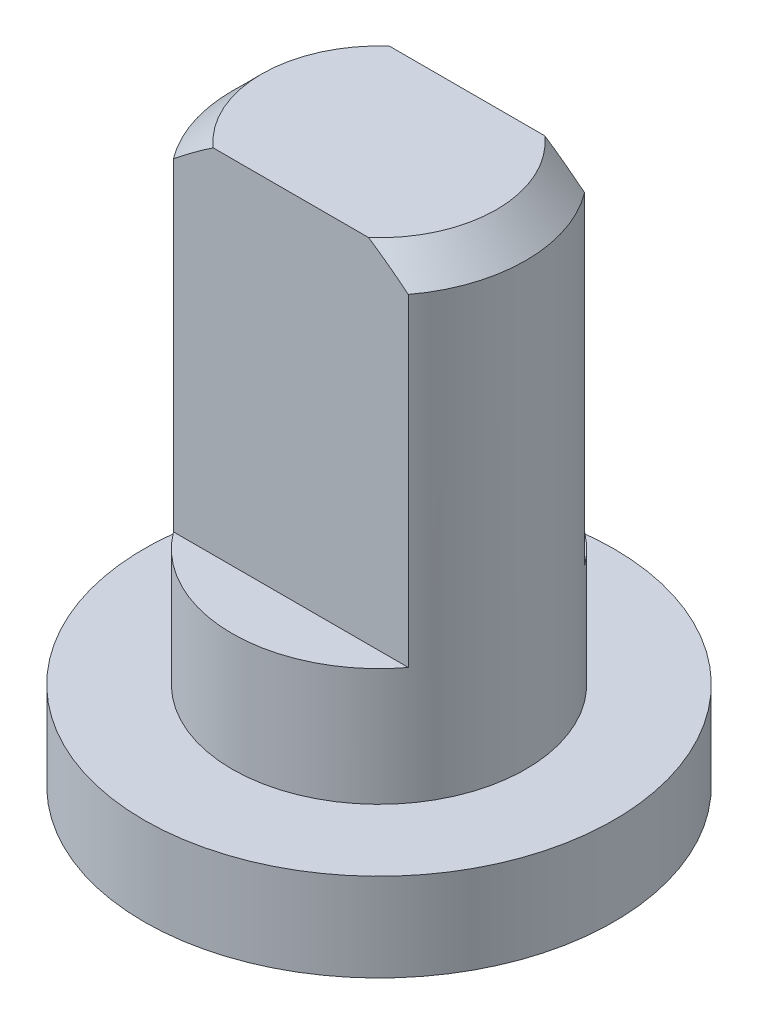
ISO-10303-21;
HEADER;
FILE_DESCRIPTION(('STEP AP214'),'2;1');
FILE_NAME('part.step','',(''),(''),'','','');
FILE_SCHEMA(('AUTOMOTIVE_DESIGN { 1 0 10303 214 1 1 1 1 }'));
ENDSEC;
DATA;
#1=APPLICATION_CONTEXT('core data for automotive mechanical design processes');
#2=APPLICATION_PROTOCOL_DEFINITION('international standard','automotive_design',2000,#1);
#3=PRODUCT_CONTEXT('',#1,'mechanical');
#4=PRODUCT('Part','Part','',(#3));
#5=PRODUCT_RELATED_PRODUCT_CATEGORY('part','',(#4));
#6=PRODUCT_DEFINITION_FORMATION('','',#4);
#7=PRODUCT_DEFINITION_CONTEXT('part definition',#1,'design');
#8=PRODUCT_DEFINITION('design','',#6,#7);
#9=PRODUCT_DEFINITION_SHAPE('','',#8);
#10=(LENGTH_UNIT() NAMED_UNIT(*) SI_UNIT(.MILLI.,.METRE.));
#11=(NAMED_UNIT(*) PLANE_ANGLE_UNIT() SI_UNIT($,.RADIAN.));
#12=(NAMED_UNIT(*) SI_UNIT($,.STERADIAN.) SOLID_ANGLE_UNIT());
#13=UNCERTAINTY_MEASURE_WITH_UNIT(LENGTH_MEASURE(1.E-05),#10,'distance_accuracy_value','');
#14=(GEOMETRIC_REPRESENTATION_CONTEXT(3) GLOBAL_UNCERTAINTY_ASSIGNED_CONTEXT((#13)) GLOBAL_UNIT_ASSIGNED_CONTEXT((#10,
#11,#12)) REPRESENTATION_CONTEXT('',''));
#15=CARTESIAN_POINT('',(0.,0.,0.));
#16=DIRECTION('',(0.,0.,1.));
#17=DIRECTION('',(1.,0.,0.));
#18=AXIS2_PLACEMENT_3D('',#15,#16,#17);
#19=CARTESIAN_POINT('',(0.,3.5,0.));
#20=DIRECTION('',(0.,1.,0.));
#21=DIRECTION('',(0.,0.,1.));
#22=AXIS2_PLACEMENT_3D('',#19,#20,#21);
#23=PLANE('',#22);
#24=DIRECTION('',(-1.,0.,0.));
#25=VECTOR('',#24,1.);
#26=CARTESIAN_POINT('',(-2.,3.5,-1.5));
#27=LINE('',#26,#25);
#28=CARTESIAN_POINT('',(2.,3.5,-1.5));
#29=VERTEX_POINT('',#28);
#30=CARTESIAN_POINT('',(-2.,3.5,-1.5));
#31=VERTEX_POINT('',#30);
#32=EDGE_CURVE('E124',#29,#31,#27,.T.);
#33=ORIENTED_EDGE('',*,*,#32,.F.);
#34=CARTESIAN_POINT('',(0.,3.5,0.));
#35=DIRECTION('',(0.,1.,0.));
#36=DIRECTION('',(0.,0.,1.));
#37=AXIS2_PLACEMENT_3D('',#34,#35,#36);
#38=CIRCLE('',#37,2.5);
#39=EDGE_CURVE('E118',#29,#31,#38,.T.);
#40=ORIENTED_EDGE('',*,*,#39,.T.);
#41=EDGE_LOOP('',(#33,#40));
#42=FACE_BOUND('',#41,.T.);
#43=ADVANCED_FACE('F47',(#42),#23,.T.);
#44=CARTESIAN_POINT('',(0.,1.5,0.));
#45=DIRECTION('',(0.,-1.,0.));
#46=DIRECTION('',(0.,0.,-1.));
#47=AXIS2_PLACEMENT_3D('',#44,#45,#46);
#48=CYLINDRICAL_SURFACE('',#47,4.);
#49=CARTESIAN_POINT('',(0.,1.5,0.));
#50=DIRECTION('',(0.,1.,0.));
#51=DIRECTION('',(0.,0.,1.));
#52=AXIS2_PLACEMENT_3D('',#49,#50,#51);
#53=CIRCLE('',#52,4.);
#54=CARTESIAN_POINT('',(0.,1.5,4.));
#55=VERTEX_POINT('',#54);
#56=EDGE_CURVE('E138',#55,#55,#53,.T.);
#57=ORIENTED_EDGE('',*,*,#56,.F.);
#58=EDGE_LOOP('',(#57));
#59=FACE_BOUND('',#58,.T.);
#60=CARTESIAN_POINT('',(0.,0.,0.));
#61=DIRECTION('',(0.,1.,0.));
#62=DIRECTION('',(0.,0.,1.));
#63=AXIS2_PLACEMENT_3D('',#60,#61,#62);
#64=CIRCLE('',#63,4.);
#65=CARTESIAN_POINT('',(0.,0.,4.));
#66=VERTEX_POINT('',#65);
#67=EDGE_CURVE('E144',#66,#66,#64,.T.);
#68=ORIENTED_EDGE('',*,*,#67,.T.);
#69=EDGE_LOOP('',(#68));
#70=FACE_BOUND('',#69,.T.);
#71=ADVANCED_FACE('F199',(#59,#70),#48,.T.);
#72=CARTESIAN_POINT('',(0.,1.5,0.));
#73=DIRECTION('',(0.,1.,0.));
#74=DIRECTION('',(0.,0.,1.));
#75=AXIS2_PLACEMENT_3D('',#72,#73,#74);
#76=PLANE('',#75);
#77=CARTESIAN_POINT('',(0.,1.5,0.));
#78=DIRECTION('',(0.,1.,0.));
#79=DIRECTION('',(0.,0.,1.));
#80=AXIS2_PLACEMENT_3D('',#77,#78,#79);
#81=CIRCLE('',#80,2.5);
#82=CARTESIAN_POINT('',(0.,1.5,2.5));
#83=VERTEX_POINT('',#82);
#84=EDGE_CURVE('E137',#83,#83,#81,.T.);
#85=ORIENTED_EDGE('',*,*,#84,.F.);
#86=EDGE_LOOP('',(#85));
#87=FACE_BOUND('',#86,.T.);
#88=ORIENTED_EDGE('',*,*,#56,.T.);
#89=EDGE_LOOP('',(#88));
#90=FACE_BOUND('',#89,.T.);
#91=ADVANCED_FACE('F205',(#87,#90),#76,.T.);
#92=CARTESIAN_POINT('',(0.,0.,0.));
#93=DIRECTION('',(0.,1.,0.));
#94=DIRECTION('',(0.,0.,1.));
#95=AXIS2_PLACEMENT_3D('',#92,#93,#94);
#96=PLANE('',#95);
#97=ORIENTED_EDGE('',*,*,#67,.F.);
#98=EDGE_LOOP('',(#97));
#99=FACE_BOUND('',#98,.T.);
#100=ADVANCED_FACE('F213',(#99),#96,.F.);
#101=CARTESIAN_POINT('',(0.,3.5,0.));
#102=DIRECTION('',(0.,-1.,0.));
#103=DIRECTION('',(0.,0.,-1.));
#104=AXIS2_PLACEMENT_3D('',#101,#102,#103);
#105=CYLINDRICAL_SURFACE('',#104,2.5);
#106=DIRECTION('',(0.,-1.,0.));
#107=VECTOR('',#106,1.);
#108=CARTESIAN_POINT('',(2.,9.5,-1.5));
#109=LINE('',#108,#107);
#110=CARTESIAN_POINT('',(2.,9.,-1.5));
#111=VERTEX_POINT('',#110);
#112=EDGE_CURVE('E113',#111,#29,#109,.T.);
#113=ORIENTED_EDGE('',*,*,#112,.F.);
#114=CARTESIAN_POINT('',(0.,9.,0.));
#115=DIRECTION('',(0.,1.,0.));
#116=DIRECTION('',(0.,0.,1.));
#117=AXIS2_PLACEMENT_3D('',#114,#115,#116);
#118=CIRCLE('',#117,2.5);
#119=CARTESIAN_POINT('',(2.,9.,1.5));
#120=VERTEX_POINT('',#119);
#121=EDGE_CURVE('E76',#111,#120,#118,.F.);
#122=ORIENTED_EDGE('',*,*,#121,.T.);
#123=DIRECTION('',(0.,-1.,0.));
#124=VECTOR('',#123,1.);
#125=CARTESIAN_POINT('',(2.,9.5,1.5));
#126=LINE('',#125,#124);
#127=CARTESIAN_POINT('',(2.,3.5,1.5));
#128=VERTEX_POINT('',#127);
#129=EDGE_CURVE('E106',#120,#128,#126,.T.);
#130=ORIENTED_EDGE('',*,*,#129,.T.);
#131=CARTESIAN_POINT('',(-2.,3.5,1.5));
#132=VERTEX_POINT('',#131);
#133=EDGE_CURVE('E109',#132,#128,#38,.T.);
#134=ORIENTED_EDGE('',*,*,#133,.F.);
#135=DIRECTION('',(0.,-1.,0.));
#136=VECTOR('',#135,1.);
#137=CARTESIAN_POINT('',(-2.,9.5,1.5));
#138=LINE('',#137,#136);
#139=CARTESIAN_POINT('',(-2.,9.,1.5));
#140=VERTEX_POINT('',#139);
#141=EDGE_CURVE('E112',#140,#132,#138,.T.);
#142=ORIENTED_EDGE('',*,*,#141,.F.);
#143=CARTESIAN_POINT('',(0.,9.,0.));
#144=DIRECTION('',(0.,1.,0.));
#145=DIRECTION('',(0.,0.,1.));
#146=AXIS2_PLACEMENT_3D('',#143,#144,#145);
#147=CIRCLE('',#146,2.5);
#148=CARTESIAN_POINT('',(-2.,9.,-1.5));
#149=VERTEX_POINT('',#148);
#150=EDGE_CURVE('E182',#140,#149,#147,.F.);
#151=ORIENTED_EDGE('',*,*,#150,.T.);
#152=DIRECTION('',(0.,-1.,0.));
#153=VECTOR('',#152,1.);
#154=CARTESIAN_POINT('',(-2.,9.5,-1.5));
#155=LINE('',#154,#153);
#156=EDGE_CURVE('E135',#149,#31,#155,.T.);
#157=ORIENTED_EDGE('',*,*,#156,.T.);
#158=ORIENTED_EDGE('',*,*,#39,.F.);
#159=EDGE_LOOP('',(#113,#122,#130,#134,#142,#151,#157,#158));
#160=FACE_BOUND('',#159,.T.);
#161=ORIENTED_EDGE('',*,*,#84,.T.);
#162=EDGE_LOOP('',(#161));
#163=FACE_BOUND('',#162,.T.);
#164=ADVANCED_FACE('F108',(#160,#163),#105,.T.);
#165=DIRECTION('',(1.,0.,0.));
#166=VECTOR('',#165,1.);
#167=CARTESIAN_POINT('',(-2.,3.5,1.5));
#168=LINE('',#167,#166);
#169=EDGE_CURVE('E116',#132,#128,#168,.T.);
#170=ORIENTED_EDGE('',*,*,#169,.F.);
#171=ORIENTED_EDGE('',*,*,#133,.T.);
#172=EDGE_LOOP('',(#170,#171));
#173=FACE_BOUND('',#172,.T.);
#174=ADVANCED_FACE('F119',(#173),#23,.T.);
#175=CARTESIAN_POINT('',(-2.,9.5,1.5));
#176=DIRECTION('',(0.,0.,-1.));
#177=DIRECTION('',(-1.,0.,0.));
#178=AXIS2_PLACEMENT_3D('',#175,#176,#177);
#179=PLANE('',#178);
#180=ORIENTED_EDGE('',*,*,#129,.F.);
#181=CARTESIAN_POINT('',(2.,9.,1.5));
#182=CARTESIAN_POINT('',(1.94519574562848,9.04383049152315,1.5));
#183=CARTESIAN_POINT('',(1.89008442466288,9.08728359883106,1.5));
#184=CARTESIAN_POINT('',(1.77913031188637,9.17318722653999,1.5));
#185=CARTESIAN_POINT('',(1.72328789412314,9.21563823070133,1.5));
#186=CARTESIAN_POINT('',(1.61069135015058,9.29934029783495,1.5));
#187=CARTESIAN_POINT('',(1.55393707734213,9.34059116480302,1.5));
#188=CARTESIAN_POINT('',(1.43929793796268,9.42154901165997,1.5));
#189=CARTESIAN_POINT('',(1.38141252497155,9.46125521621063,1.5));
#190=CARTESIAN_POINT('',(1.32287565553229,9.5,1.5));
#191=B_SPLINE_CURVE_WITH_KNOTS('',3,(#181,#182,#183,#184,#185,#186,#187,#188,#189,#190),
.UNSPECIFIED.,.F.,.F.,(4,2,2,2,4),(0.,0.210530922760912,0.420958043644346,0.631419340349597,
0.841984949079767),.UNSPECIFIED.);
#192=CARTESIAN_POINT('',(1.32287565553229,9.5,1.5));
#193=VERTEX_POINT('',#192);
#194=EDGE_CURVE('E11',#120,#193,#191,.T.);
#195=ORIENTED_EDGE('',*,*,#194,.T.);
#196=DIRECTION('',(1.,0.,0.));
#197=VECTOR('',#196,1.);
#198=CARTESIAN_POINT('',(-2.,9.5,1.5));
#199=LINE('',#198,#197);
#200=CARTESIAN_POINT('',(-1.32287565553229,9.5,1.5));
#201=VERTEX_POINT('',#200);
#202=EDGE_CURVE('E126',#201,#193,#199,.T.);
#203=ORIENTED_EDGE('',*,*,#202,.F.);
#204=CARTESIAN_POINT('',(-1.32287565553229,9.5,1.5));
#205=CARTESIAN_POINT('',(-1.38141252497155,9.46125521621063,1.5));
#206=CARTESIAN_POINT('',(-1.43929793796268,9.42154901165997,1.5));
#207=CARTESIAN_POINT('',(-1.55393707734213,9.34059116480302,1.5));
#208=CARTESIAN_POINT('',(-1.61069135015058,9.29934029783495,1.5));
#209=CARTESIAN_POINT('',(-1.72328789412314,9.21563823070133,1.5));
#210=CARTESIAN_POINT('',(-1.77913031188637,9.17318722653999,1.5));
#211=CARTESIAN_POINT('',(-1.89008442466288,9.08728359883106,1.5));
#212=CARTESIAN_POINT('',(-1.94519574562848,9.04383049152315,1.5));
#213=CARTESIAN_POINT('',(-2.,9.,1.5));
#214=B_SPLINE_CURVE_WITH_KNOTS('',3,(#204,#205,#206,#207,#208,#209,#210,#211,#212,#213),
.UNSPECIFIED.,.F.,.F.,(4,2,2,2,4),(0.,0.210565608730169,0.421026905435421,0.631454026318854,
0.841984949079766),.UNSPECIFIED.);
#215=EDGE_CURVE('E61',#201,#140,#214,.T.);
#216=ORIENTED_EDGE('',*,*,#215,.T.);
#217=ORIENTED_EDGE('',*,*,#141,.T.);
#218=ORIENTED_EDGE('',*,*,#169,.T.);
#219=EDGE_LOOP('',(#180,#195,#203,#216,#217,#218));
#220=FACE_BOUND('',#219,.T.);
#221=ADVANCED_FACE('F125',(#220),#179,.F.);
#222=CARTESIAN_POINT('',(-2.,9.5,-1.5));
#223=DIRECTION('',(0.,0.,1.));
#224=DIRECTION('',(1.,0.,0.));
#225=AXIS2_PLACEMENT_3D('',#222,#223,#224);
#226=PLANE('',#225);
#227=DIRECTION('',(-1.,0.,0.));
#228=VECTOR('',#227,1.);
#229=CARTESIAN_POINT('',(-2.,9.5,-1.5));
#230=LINE('',#229,#228);
#231=CARTESIAN_POINT('',(1.32287565553229,9.5,-1.5));
#232=VERTEX_POINT('',#231);
#233=CARTESIAN_POINT('',(-1.32287565553229,9.5,-1.5));
#234=VERTEX_POINT('',#233);
#235=EDGE_CURVE('E127',#232,#234,#230,.T.);
#236=ORIENTED_EDGE('',*,*,#235,.F.);
#237=CARTESIAN_POINT('',(1.32287565553229,9.5,-1.5));
#238=CARTESIAN_POINT('',(1.38141252497155,9.46125521621063,-1.5));
#239=CARTESIAN_POINT('',(1.43929793796268,9.42154901165997,-1.5));
#240=CARTESIAN_POINT('',(1.55393707734213,9.34059116480302,-1.5));
#241=CARTESIAN_POINT('',(1.61069135015058,9.29934029783495,-1.5));
#242=CARTESIAN_POINT('',(1.72328789412314,9.21563823070133,-1.5));
#243=CARTESIAN_POINT('',(1.77913031188637,9.17318722653999,-1.5));
#244=CARTESIAN_POINT('',(1.89008442466288,9.08728359883106,-1.5));
#245=CARTESIAN_POINT('',(1.94519574562848,9.04383049152315,-1.5));
#246=CARTESIAN_POINT('',(2.,9.,-1.5));
#247=B_SPLINE_CURVE_WITH_KNOTS('',3,(#237,#238,#239,#240,#241,#242,#243,#244,#245,#246),
.UNSPECIFIED.,.F.,.F.,(4,2,2,2,4),(0.,0.210565608730169,0.421026905435421,0.631454026318854,
0.841984949079766),.UNSPECIFIED.);
#248=EDGE_CURVE('E156',#232,#111,#247,.T.);
#249=ORIENTED_EDGE('',*,*,#248,.T.);
#250=ORIENTED_EDGE('',*,*,#112,.T.);
#251=ORIENTED_EDGE('',*,*,#32,.T.);
#252=ORIENTED_EDGE('',*,*,#156,.F.);
#253=CARTESIAN_POINT('',(-2.,9.,-1.5));
#254=CARTESIAN_POINT('',(-1.94519574562848,9.04383049152315,-1.5));
#255=CARTESIAN_POINT('',(-1.89008442466288,9.08728359883106,-1.5));
#256=CARTESIAN_POINT('',(-1.77913031188637,9.17318722653999,-1.5));
#257=CARTESIAN_POINT('',(-1.72328789412314,9.21563823070133,-1.5));
#258=CARTESIAN_POINT('',(-1.61069135015058,9.29934029783495,-1.5));
#259=CARTESIAN_POINT('',(-1.55393707734213,9.34059116480302,-1.5));
#260=CARTESIAN_POINT('',(-1.43929793796268,9.42154901165997,-1.5));
#261=CARTESIAN_POINT('',(-1.38141252497155,9.46125521621063,-1.5));
#262=CARTESIAN_POINT('',(-1.32287565553229,9.5,-1.5));
#263=B_SPLINE_CURVE_WITH_KNOTS('',3,(#253,#254,#255,#256,#257,#258,#259,#260,#261,#262),
.UNSPECIFIED.,.F.,.F.,(4,2,2,2,4),(0.,0.210530922760912,0.420958043644345,0.631419340349597,
0.841984949079767),.UNSPECIFIED.);
#264=EDGE_CURVE('E153',#149,#234,#263,.T.);
#265=ORIENTED_EDGE('',*,*,#264,.T.);
#266=EDGE_LOOP('',(#236,#249,#250,#251,#252,#265));
#267=FACE_BOUND('',#266,.T.);
#268=ADVANCED_FACE('F162',(#267),#226,.F.);
#269=CARTESIAN_POINT('',(0.,9.5,0.));
#270=DIRECTION('',(0.,1.,0.));
#271=DIRECTION('',(0.,0.,1.));
#272=AXIS2_PLACEMENT_3D('',#269,#270,#271);
#273=PLANE('',#272);
#274=ORIENTED_EDGE('',*,*,#202,.T.);
#275=CARTESIAN_POINT('',(0.,9.5,0.));
#276=DIRECTION('',(0.,1.,0.));
#277=DIRECTION('',(0.,0.,1.));
#278=AXIS2_PLACEMENT_3D('',#275,#276,#277);
#279=CIRCLE('',#278,2.);
#280=EDGE_CURVE('E148',#193,#232,#279,.T.);
#281=ORIENTED_EDGE('',*,*,#280,.T.);
#282=ORIENTED_EDGE('',*,*,#235,.T.);
#283=CARTESIAN_POINT('',(0.,9.5,0.));
#284=DIRECTION('',(0.,1.,0.));
#285=DIRECTION('',(0.,0.,1.));
#286=AXIS2_PLACEMENT_3D('',#283,#284,#285);
#287=CIRCLE('',#286,2.);
#288=EDGE_CURVE('E139',#234,#201,#287,.T.);
#289=ORIENTED_EDGE('',*,*,#288,.T.);
#290=EDGE_LOOP('',(#274,#281,#282,#289));
#291=FACE_BOUND('',#290,.T.);
#292=ADVANCED_FACE('F168',(#291),#273,.T.);
#293=CARTESIAN_POINT('',(0.,9.5,0.));
#294=DIRECTION('',(0.,-1.,0.));
#295=DIRECTION('',(0.,0.,-1.));
#296=AXIS2_PLACEMENT_3D('',#293,#294,#295);
#297=CONICAL_SURFACE('',#296,2.,0.785398163397446);
#298=ORIENTED_EDGE('',*,*,#194,.F.);
#299=ORIENTED_EDGE('',*,*,#121,.F.);
#300=ORIENTED_EDGE('',*,*,#248,.F.);
#301=ORIENTED_EDGE('',*,*,#280,.F.);
#302=EDGE_LOOP('',(#298,#299,#300,#301));
#303=FACE_BOUND('',#302,.T.);
#304=ADVANCED_FACE('F191',(#303),#297,.T.);
#305=CARTESIAN_POINT('',(0.,9.5,0.));
#306=DIRECTION('',(0.,-1.,0.));
#307=DIRECTION('',(0.,0.,-1.));
#308=AXIS2_PLACEMENT_3D('',#305,#306,#307);
#309=CONICAL_SURFACE('',#308,2.,0.785398163397446);
#310=ORIENTED_EDGE('',*,*,#264,.F.);
#311=ORIENTED_EDGE('',*,*,#150,.F.);
#312=ORIENTED_EDGE('',*,*,#215,.F.);
#313=ORIENTED_EDGE('',*,*,#288,.F.);
#314=EDGE_LOOP('',(#310,#311,#312,#313));
#315=FACE_BOUND('',#314,.T.);
#316=ADVANCED_FACE('F55',(#315),#309,.T.);
#317=CLOSED_SHELL('',(#43,#71,#91,#100,#164,#174,#221,#268,#292,#304,#316));
#318=MANIFOLD_SOLID_BREP('B2',#317);
#319=ADVANCED_BREP_SHAPE_REPRESENTATION('',(#18,#318),#14);
#320=SHAPE_DEFINITION_REPRESENTATION(#9,#319);
ENDSEC;
END-ISO-10303-21;
